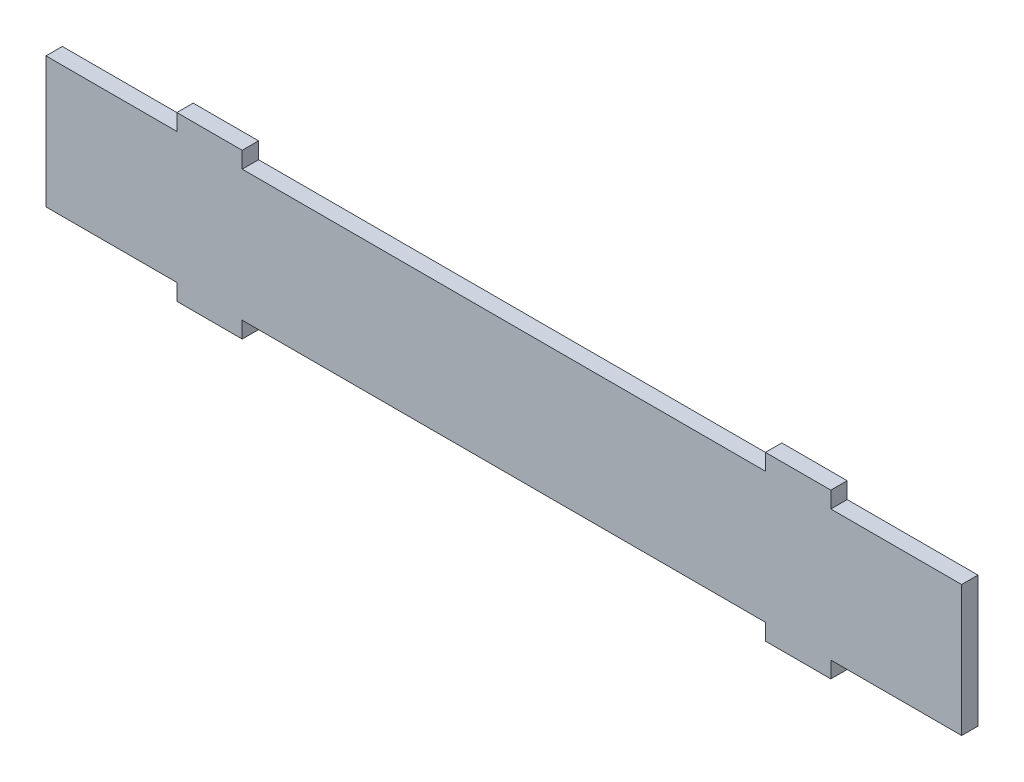
ISO-10303-21;
HEADER;
FILE_DESCRIPTION(('STEP AP214'),'2;1');
FILE_NAME('part.step','',(''),(''),'','','');
FILE_SCHEMA(('AUTOMOTIVE_DESIGN { 1 0 10303 214 1 1 1 1 }'));
ENDSEC;
DATA;
#1=APPLICATION_CONTEXT('core data for automotive mechanical design processes');
#2=APPLICATION_PROTOCOL_DEFINITION('international standard','automotive_design',2000,#1);
#3=PRODUCT_CONTEXT('',#1,'mechanical');
#4=PRODUCT('Part','Part','',(#3));
#5=PRODUCT_RELATED_PRODUCT_CATEGORY('part','',(#4));
#6=PRODUCT_DEFINITION_FORMATION('','',#4);
#7=PRODUCT_DEFINITION_CONTEXT('part definition',#1,'design');
#8=PRODUCT_DEFINITION('design','',#6,#7);
#9=PRODUCT_DEFINITION_SHAPE('','',#8);
#10=(LENGTH_UNIT() NAMED_UNIT(*) SI_UNIT(.MILLI.,.METRE.));
#11=(NAMED_UNIT(*) PLANE_ANGLE_UNIT() SI_UNIT($,.RADIAN.));
#12=(NAMED_UNIT(*) SI_UNIT($,.STERADIAN.) SOLID_ANGLE_UNIT());
#13=UNCERTAINTY_MEASURE_WITH_UNIT(LENGTH_MEASURE(1.E-05),#10,'distance_accuracy_value','');
#14=(GEOMETRIC_REPRESENTATION_CONTEXT(3) GLOBAL_UNCERTAINTY_ASSIGNED_CONTEXT((#13)) GLOBAL_UNIT_ASSIGNED_CONTEXT((#10,
#11,#12)) REPRESENTATION_CONTEXT('',''));
#15=CARTESIAN_POINT('',(0.,0.,0.));
#16=DIRECTION('',(0.,0.,1.));
#17=DIRECTION('',(1.,0.,0.));
#18=AXIS2_PLACEMENT_3D('',#15,#16,#17);
#19=CARTESIAN_POINT('',(0.,0.,3.175));
#20=DIRECTION('',(0.,1.,0.));
#21=DIRECTION('',(0.,0.,1.));
#22=AXIS2_PLACEMENT_3D('',#19,#20,#21);
#23=PLANE('',#22);
#24=DIRECTION('',(0.,0.,-1.));
#25=VECTOR('',#24,1.);
#26=CARTESIAN_POINT('',(139.7,0.,3.175));
#27=LINE('',#26,#25);
#28=CARTESIAN_POINT('',(139.7,0.,3.175));
#29=VERTEX_POINT('',#28);
#30=CARTESIAN_POINT('',(139.7,0.,0.));
#31=VERTEX_POINT('',#30);
#32=EDGE_CURVE('E58',#29,#31,#27,.T.);
#33=ORIENTED_EDGE('',*,*,#32,.F.);
#34=DIRECTION('',(1.,0.,0.));
#35=VECTOR('',#34,1.);
#36=CARTESIAN_POINT('',(0.,0.,3.175));
#37=LINE('',#36,#35);
#38=CARTESIAN_POINT('',(38.1,0.,3.175));
#39=VERTEX_POINT('',#38);
#40=EDGE_CURVE('E341',#39,#29,#37,.T.);
#41=ORIENTED_EDGE('',*,*,#40,.F.);
#42=DIRECTION('',(0.,0.,1.));
#43=VECTOR('',#42,1.);
#44=CARTESIAN_POINT('',(38.1,0.,3.175));
#45=LINE('',#44,#43);
#46=CARTESIAN_POINT('',(38.1,0.,0.));
#47=VERTEX_POINT('',#46);
#48=EDGE_CURVE('E200',#47,#39,#45,.T.);
#49=ORIENTED_EDGE('',*,*,#48,.F.);
#50=DIRECTION('',(1.,0.,0.));
#51=VECTOR('',#50,1.);
#52=CARTESIAN_POINT('',(0.,0.,0.));
#53=LINE('',#52,#51);
#54=EDGE_CURVE('E230',#47,#31,#53,.T.);
#55=ORIENTED_EDGE('',*,*,#54,.T.);
#56=EDGE_LOOP('',(#33,#41,#49,#55));
#57=FACE_BOUND('',#56,.T.);
#58=ADVANCED_FACE('F33',(#57),#23,.F.);
#59=DIRECTION('',(0.,0.,1.));
#60=VECTOR('',#59,1.);
#61=CARTESIAN_POINT('',(152.4,0.,3.175));
#62=LINE('',#61,#60);
#63=CARTESIAN_POINT('',(152.4,0.,0.));
#64=VERTEX_POINT('',#63);
#65=CARTESIAN_POINT('',(152.4,0.,3.175));
#66=VERTEX_POINT('',#65);
#67=EDGE_CURVE('E194',#64,#66,#62,.T.);
#68=ORIENTED_EDGE('',*,*,#67,.F.);
#69=CARTESIAN_POINT('',(177.8,0.,0.));
#70=VERTEX_POINT('',#69);
#71=EDGE_CURVE('E228',#64,#70,#53,.T.);
#72=ORIENTED_EDGE('',*,*,#71,.T.);
#73=DIRECTION('',(0.,0.,-1.));
#74=VECTOR('',#73,1.);
#75=CARTESIAN_POINT('',(177.8,0.,3.175));
#76=LINE('',#75,#74);
#77=CARTESIAN_POINT('',(177.8,0.,3.175));
#78=VERTEX_POINT('',#77);
#79=EDGE_CURVE('E43',#78,#70,#76,.T.);
#80=ORIENTED_EDGE('',*,*,#79,.F.);
#81=EDGE_CURVE('E37',#66,#78,#37,.T.);
#82=ORIENTED_EDGE('',*,*,#81,.F.);
#83=EDGE_LOOP('',(#68,#72,#80,#82));
#84=FACE_BOUND('',#83,.T.);
#85=ADVANCED_FACE('F359',(#84),#23,.F.);
#86=DIRECTION('',(0.,0.,-1.));
#87=VECTOR('',#86,1.);
#88=CARTESIAN_POINT('',(25.4,0.,3.175));
#89=LINE('',#88,#87);
#90=CARTESIAN_POINT('',(25.4,0.,3.175));
#91=VERTEX_POINT('',#90);
#92=CARTESIAN_POINT('',(25.4,0.,0.));
#93=VERTEX_POINT('',#92);
#94=EDGE_CURVE('E197',#91,#93,#89,.T.);
#95=ORIENTED_EDGE('',*,*,#94,.F.);
#96=CARTESIAN_POINT('',(0.,0.,3.175));
#97=VERTEX_POINT('',#96);
#98=EDGE_CURVE('E343',#97,#91,#37,.T.);
#99=ORIENTED_EDGE('',*,*,#98,.F.);
#100=DIRECTION('',(0.,0.,-1.));
#101=VECTOR('',#100,1.);
#102=CARTESIAN_POINT('',(0.,0.,3.175));
#103=LINE('',#102,#101);
#104=CARTESIAN_POINT('',(0.,0.,0.));
#105=VERTEX_POINT('',#104);
#106=EDGE_CURVE('E11',#97,#105,#103,.T.);
#107=ORIENTED_EDGE('',*,*,#106,.T.);
#108=EDGE_CURVE('E243',#105,#93,#53,.T.);
#109=ORIENTED_EDGE('',*,*,#108,.T.);
#110=EDGE_LOOP('',(#95,#99,#107,#109));
#111=FACE_BOUND('',#110,.T.);
#112=ADVANCED_FACE('F361',(#111),#23,.F.);
#113=CARTESIAN_POINT('',(0.,25.4,3.175));
#114=DIRECTION('',(0.,-1.,0.));
#115=DIRECTION('',(0.,0.,-1.));
#116=AXIS2_PLACEMENT_3D('',#113,#114,#115);
#117=PLANE('',#116);
#118=DIRECTION('',(0.,0.,1.));
#119=VECTOR('',#118,1.);
#120=CARTESIAN_POINT('',(139.7,25.4,0.));
#121=LINE('',#120,#119);
#122=CARTESIAN_POINT('',(139.7,25.4,0.));
#123=VERTEX_POINT('',#122);
#124=CARTESIAN_POINT('',(139.7,25.4,3.175));
#125=VERTEX_POINT('',#124);
#126=EDGE_CURVE('E298',#123,#125,#121,.T.);
#127=ORIENTED_EDGE('',*,*,#126,.F.);
#128=DIRECTION('',(-1.,0.,0.));
#129=VECTOR('',#128,1.);
#130=CARTESIAN_POINT('',(0.,25.4,0.));
#131=LINE('',#130,#129);
#132=CARTESIAN_POINT('',(38.1,25.4,0.));
#133=VERTEX_POINT('',#132);
#134=EDGE_CURVE('E249',#123,#133,#131,.T.);
#135=ORIENTED_EDGE('',*,*,#134,.T.);
#136=DIRECTION('',(0.,0.,-1.));
#137=VECTOR('',#136,1.);
#138=CARTESIAN_POINT('',(38.1,25.4,0.));
#139=LINE('',#138,#137);
#140=CARTESIAN_POINT('',(38.1,25.4,3.175));
#141=VERTEX_POINT('',#140);
#142=EDGE_CURVE('E295',#141,#133,#139,.T.);
#143=ORIENTED_EDGE('',*,*,#142,.F.);
#144=DIRECTION('',(-1.,0.,0.));
#145=VECTOR('',#144,1.);
#146=CARTESIAN_POINT('',(0.,25.4,3.175));
#147=LINE('',#146,#145);
#148=EDGE_CURVE('E245',#125,#141,#147,.T.);
#149=ORIENTED_EDGE('',*,*,#148,.F.);
#150=EDGE_LOOP('',(#127,#135,#143,#149));
#151=FACE_BOUND('',#150,.T.);
#152=ADVANCED_FACE('F294',(#151),#117,.F.);
#153=DIRECTION('',(0.,0.,-1.));
#154=VECTOR('',#153,1.);
#155=CARTESIAN_POINT('',(152.4,25.4,0.));
#156=LINE('',#155,#154);
#157=CARTESIAN_POINT('',(152.4,25.4,3.175));
#158=VERTEX_POINT('',#157);
#159=CARTESIAN_POINT('',(152.4,25.4,0.));
#160=VERTEX_POINT('',#159);
#161=EDGE_CURVE('E577',#158,#160,#156,.T.);
#162=ORIENTED_EDGE('',*,*,#161,.F.);
#163=CARTESIAN_POINT('',(177.8,25.4,3.175));
#164=VERTEX_POINT('',#163);
#165=EDGE_CURVE('E247',#164,#158,#147,.T.);
#166=ORIENTED_EDGE('',*,*,#165,.F.);
#167=DIRECTION('',(0.,0.,-1.));
#168=VECTOR('',#167,1.);
#169=CARTESIAN_POINT('',(177.8,25.4,3.175));
#170=LINE('',#169,#168);
#171=CARTESIAN_POINT('',(177.8,25.4,0.));
#172=VERTEX_POINT('',#171);
#173=EDGE_CURVE('E271',#164,#172,#170,.T.);
#174=ORIENTED_EDGE('',*,*,#173,.T.);
#175=EDGE_CURVE('E264',#172,#160,#131,.T.);
#176=ORIENTED_EDGE('',*,*,#175,.T.);
#177=EDGE_LOOP('',(#162,#166,#174,#176));
#178=FACE_BOUND('',#177,.T.);
#179=ADVANCED_FACE('F373',(#178),#117,.F.);
#180=DIRECTION('',(0.,0.,1.));
#181=VECTOR('',#180,1.);
#182=CARTESIAN_POINT('',(25.4,25.4,0.));
#183=LINE('',#182,#181);
#184=CARTESIAN_POINT('',(25.4,25.4,0.));
#185=VERTEX_POINT('',#184);
#186=CARTESIAN_POINT('',(25.4,25.4,3.175));
#187=VERTEX_POINT('',#186);
#188=EDGE_CURVE('E311',#185,#187,#183,.T.);
#189=ORIENTED_EDGE('',*,*,#188,.F.);
#190=CARTESIAN_POINT('',(0.,25.4,0.));
#191=VERTEX_POINT('',#190);
#192=EDGE_CURVE('E262',#185,#191,#131,.T.);
#193=ORIENTED_EDGE('',*,*,#192,.T.);
#194=DIRECTION('',(0.,0.,-1.));
#195=VECTOR('',#194,1.);
#196=CARTESIAN_POINT('',(0.,25.4,3.175));
#197=LINE('',#196,#195);
#198=CARTESIAN_POINT('',(0.,25.4,3.175));
#199=VERTEX_POINT('',#198);
#200=EDGE_CURVE('E261',#199,#191,#197,.T.);
#201=ORIENTED_EDGE('',*,*,#200,.F.);
#202=EDGE_CURVE('E248',#187,#199,#147,.T.);
#203=ORIENTED_EDGE('',*,*,#202,.F.);
#204=EDGE_LOOP('',(#189,#193,#201,#203));
#205=FACE_BOUND('',#204,.T.);
#206=ADVANCED_FACE('F370',(#205),#117,.F.);
#207=CARTESIAN_POINT('',(0.,0.,3.175));
#208=DIRECTION('',(1.,0.,0.));
#209=DIRECTION('',(0.,0.,-1.));
#210=AXIS2_PLACEMENT_3D('',#207,#208,#209);
#211=PLANE('',#210);
#212=DIRECTION('',(0.,-1.,0.));
#213=VECTOR('',#212,1.);
#214=CARTESIAN_POINT('',(0.,0.,0.));
#215=LINE('',#214,#213);
#216=EDGE_CURVE('E231',#191,#105,#215,.T.);
#217=ORIENTED_EDGE('',*,*,#216,.T.);
#218=ORIENTED_EDGE('',*,*,#106,.F.);
#219=DIRECTION('',(0.,-1.,0.));
#220=VECTOR('',#219,1.);
#221=CARTESIAN_POINT('',(0.,0.,3.175));
#222=LINE('',#221,#220);
#223=EDGE_CURVE('E287',#199,#97,#222,.T.);
#224=ORIENTED_EDGE('',*,*,#223,.F.);
#225=ORIENTED_EDGE('',*,*,#200,.T.);
#226=EDGE_LOOP('',(#217,#218,#224,#225));
#227=FACE_BOUND('',#226,.T.);
#228=ADVANCED_FACE('F35',(#227),#211,.F.);
#229=CARTESIAN_POINT('',(177.8,0.,3.175));
#230=DIRECTION('',(-1.,0.,0.));
#231=DIRECTION('',(0.,0.,1.));
#232=AXIS2_PLACEMENT_3D('',#229,#230,#231);
#233=PLANE('',#232);
#234=DIRECTION('',(0.,1.,0.));
#235=VECTOR('',#234,1.);
#236=CARTESIAN_POINT('',(177.8,0.,0.));
#237=LINE('',#236,#235);
#238=EDGE_CURVE('E236',#70,#172,#237,.T.);
#239=ORIENTED_EDGE('',*,*,#238,.T.);
#240=ORIENTED_EDGE('',*,*,#173,.F.);
#241=DIRECTION('',(0.,1.,0.));
#242=VECTOR('',#241,1.);
#243=CARTESIAN_POINT('',(177.8,0.,3.175));
#244=LINE('',#243,#242);
#245=EDGE_CURVE('E253',#78,#164,#244,.T.);
#246=ORIENTED_EDGE('',*,*,#245,.F.);
#247=ORIENTED_EDGE('',*,*,#79,.T.);
#248=EDGE_LOOP('',(#239,#240,#246,#247));
#249=FACE_BOUND('',#248,.T.);
#250=ADVANCED_FACE('F278',(#249),#233,.F.);
#251=CARTESIAN_POINT('',(0.,0.,3.175));
#252=DIRECTION('',(0.,0.,-1.));
#253=DIRECTION('',(-1.,0.,0.));
#254=AXIS2_PLACEMENT_3D('',#251,#252,#253);
#255=PLANE('',#254);
#256=ORIENTED_EDGE('',*,*,#223,.T.);
#257=ORIENTED_EDGE('',*,*,#98,.T.);
#258=DIRECTION('',(0.,1.,0.));
#259=VECTOR('',#258,1.);
#260=CARTESIAN_POINT('',(25.4,-3.175,3.175));
#261=LINE('',#260,#259);
#262=CARTESIAN_POINT('',(25.4,-3.175,3.175));
#263=VERTEX_POINT('',#262);
#264=EDGE_CURVE('E215',#263,#91,#261,.T.);
#265=ORIENTED_EDGE('',*,*,#264,.F.);
#266=DIRECTION('',(-1.,0.,0.));
#267=VECTOR('',#266,1.);
#268=CARTESIAN_POINT('',(25.4,-3.175,3.175));
#269=LINE('',#268,#267);
#270=CARTESIAN_POINT('',(38.1,-3.175,3.175));
#271=VERTEX_POINT('',#270);
#272=EDGE_CURVE('E213',#271,#263,#269,.T.);
#273=ORIENTED_EDGE('',*,*,#272,.F.);
#274=DIRECTION('',(0.,1.,0.));
#275=VECTOR('',#274,1.);
#276=CARTESIAN_POINT('',(38.1,-3.175,3.175));
#277=LINE('',#276,#275);
#278=EDGE_CURVE('E226',#271,#39,#277,.T.);
#279=ORIENTED_EDGE('',*,*,#278,.T.);
#280=ORIENTED_EDGE('',*,*,#40,.T.);
#281=DIRECTION('',(0.,1.,0.));
#282=VECTOR('',#281,1.);
#283=CARTESIAN_POINT('',(139.7,-3.175,3.175));
#284=LINE('',#283,#282);
#285=CARTESIAN_POINT('',(139.7,-3.175,3.175));
#286=VERTEX_POINT('',#285);
#287=EDGE_CURVE('E352',#286,#29,#284,.T.);
#288=ORIENTED_EDGE('',*,*,#287,.F.);
#289=DIRECTION('',(-1.,0.,0.));
#290=VECTOR('',#289,1.);
#291=CARTESIAN_POINT('',(139.7,-3.175,3.175));
#292=LINE('',#291,#290);
#293=CARTESIAN_POINT('',(152.4,-3.175,3.175));
#294=VERTEX_POINT('',#293);
#295=EDGE_CURVE('E190',#294,#286,#292,.T.);
#296=ORIENTED_EDGE('',*,*,#295,.F.);
#297=DIRECTION('',(0.,1.,0.));
#298=VECTOR('',#297,1.);
#299=CARTESIAN_POINT('',(152.4,-3.175,3.175));
#300=LINE('',#299,#298);
#301=EDGE_CURVE('E202',#294,#66,#300,.T.);
#302=ORIENTED_EDGE('',*,*,#301,.T.);
#303=ORIENTED_EDGE('',*,*,#81,.T.);
#304=ORIENTED_EDGE('',*,*,#245,.T.);
#305=ORIENTED_EDGE('',*,*,#165,.T.);
#306=DIRECTION('',(0.,-1.,0.));
#307=VECTOR('',#306,1.);
#308=CARTESIAN_POINT('',(152.4,28.575,3.175));
#309=LINE('',#308,#307);
#310=CARTESIAN_POINT('',(152.4,28.575,3.175));
#311=VERTEX_POINT('',#310);
#312=EDGE_CURVE('E582',#311,#158,#309,.T.);
#313=ORIENTED_EDGE('',*,*,#312,.F.);
#314=DIRECTION('',(1.,0.,0.));
#315=VECTOR('',#314,1.);
#316=CARTESIAN_POINT('',(139.7,28.575,3.175));
#317=LINE('',#316,#315);
#318=CARTESIAN_POINT('',(139.7,28.575,3.175));
#319=VERTEX_POINT('',#318);
#320=EDGE_CURVE('E601',#319,#311,#317,.T.);
#321=ORIENTED_EDGE('',*,*,#320,.F.);
#322=DIRECTION('',(0.,-1.,0.));
#323=VECTOR('',#322,1.);
#324=CARTESIAN_POINT('',(139.7,28.575,3.175));
#325=LINE('',#324,#323);
#326=EDGE_CURVE('E332',#319,#125,#325,.T.);
#327=ORIENTED_EDGE('',*,*,#326,.T.);
#328=ORIENTED_EDGE('',*,*,#148,.T.);
#329=DIRECTION('',(0.,-1.,0.));
#330=VECTOR('',#329,1.);
#331=CARTESIAN_POINT('',(38.1,28.575,3.175));
#332=LINE('',#331,#330);
#333=CARTESIAN_POINT('',(38.1,28.575,3.175));
#334=VERTEX_POINT('',#333);
#335=EDGE_CURVE('E309',#334,#141,#332,.T.);
#336=ORIENTED_EDGE('',*,*,#335,.F.);
#337=DIRECTION('',(1.,0.,0.));
#338=VECTOR('',#337,1.);
#339=CARTESIAN_POINT('',(25.4,28.575,3.175));
#340=LINE('',#339,#338);
#341=CARTESIAN_POINT('',(25.4,28.575,3.175));
#342=VERTEX_POINT('',#341);
#343=EDGE_CURVE('E594',#342,#334,#340,.T.);
#344=ORIENTED_EDGE('',*,*,#343,.F.);
#345=DIRECTION('',(0.,-1.,0.));
#346=VECTOR('',#345,1.);
#347=CARTESIAN_POINT('',(25.4,28.575,3.175));
#348=LINE('',#347,#346);
#349=EDGE_CURVE('E316',#342,#187,#348,.T.);
#350=ORIENTED_EDGE('',*,*,#349,.T.);
#351=ORIENTED_EDGE('',*,*,#202,.T.);
#352=EDGE_LOOP('',(#256,#257,#265,#273,#279,#280,#288,#296,#302,#303,#304,#305,#313,#321,#327,
#328,#336,#344,#350,#351));
#353=FACE_BOUND('',#352,.T.);
#354=ADVANCED_FACE('F349',(#353),#255,.F.);
#355=CARTESIAN_POINT('',(0.,0.,0.));
#356=DIRECTION('',(0.,0.,-1.));
#357=DIRECTION('',(-1.,0.,0.));
#358=AXIS2_PLACEMENT_3D('',#355,#356,#357);
#359=PLANE('',#358);
#360=ORIENTED_EDGE('',*,*,#216,.F.);
#361=ORIENTED_EDGE('',*,*,#192,.F.);
#362=DIRECTION('',(0.,-1.,0.));
#363=VECTOR('',#362,1.);
#364=CARTESIAN_POINT('',(25.4,28.575,0.));
#365=LINE('',#364,#363);
#366=CARTESIAN_POINT('',(25.4,28.575,0.));
#367=VERTEX_POINT('',#366);
#368=EDGE_CURVE('E314',#367,#185,#365,.T.);
#369=ORIENTED_EDGE('',*,*,#368,.F.);
#370=DIRECTION('',(-1.,0.,0.));
#371=VECTOR('',#370,1.);
#372=CARTESIAN_POINT('',(25.4,28.575,0.));
#373=LINE('',#372,#371);
#374=CARTESIAN_POINT('',(38.1,28.575,0.));
#375=VERTEX_POINT('',#374);
#376=EDGE_CURVE('E313',#375,#367,#373,.T.);
#377=ORIENTED_EDGE('',*,*,#376,.F.);
#378=DIRECTION('',(0.,-1.,0.));
#379=VECTOR('',#378,1.);
#380=CARTESIAN_POINT('',(38.1,28.575,0.));
#381=LINE('',#380,#379);
#382=EDGE_CURVE('E306',#375,#133,#381,.T.);
#383=ORIENTED_EDGE('',*,*,#382,.T.);
#384=ORIENTED_EDGE('',*,*,#134,.F.);
#385=DIRECTION('',(0.,-1.,0.));
#386=VECTOR('',#385,1.);
#387=CARTESIAN_POINT('',(139.7,28.575,0.));
#388=LINE('',#387,#386);
#389=CARTESIAN_POINT('',(139.7,28.575,0.));
#390=VERTEX_POINT('',#389);
#391=EDGE_CURVE('E588',#390,#123,#388,.T.);
#392=ORIENTED_EDGE('',*,*,#391,.F.);
#393=DIRECTION('',(-1.,0.,0.));
#394=VECTOR('',#393,1.);
#395=CARTESIAN_POINT('',(139.7,28.575,0.));
#396=LINE('',#395,#394);
#397=CARTESIAN_POINT('',(152.4,28.575,0.));
#398=VERTEX_POINT('',#397);
#399=EDGE_CURVE('E609',#398,#390,#396,.T.);
#400=ORIENTED_EDGE('',*,*,#399,.F.);
#401=DIRECTION('',(0.,-1.,0.));
#402=VECTOR('',#401,1.);
#403=CARTESIAN_POINT('',(152.4,28.575,0.));
#404=LINE('',#403,#402);
#405=EDGE_CURVE('E284',#398,#160,#404,.T.);
#406=ORIENTED_EDGE('',*,*,#405,.T.);
#407=ORIENTED_EDGE('',*,*,#175,.F.);
#408=ORIENTED_EDGE('',*,*,#238,.F.);
#409=ORIENTED_EDGE('',*,*,#71,.F.);
#410=DIRECTION('',(0.,1.,0.));
#411=VECTOR('',#410,1.);
#412=CARTESIAN_POINT('',(152.4,-3.175,0.));
#413=LINE('',#412,#411);
#414=CARTESIAN_POINT('',(152.4,-3.175,0.));
#415=VERTEX_POINT('',#414);
#416=EDGE_CURVE('E181',#415,#64,#413,.T.);
#417=ORIENTED_EDGE('',*,*,#416,.F.);
#418=DIRECTION('',(1.,0.,0.));
#419=VECTOR('',#418,1.);
#420=CARTESIAN_POINT('',(139.7,-3.175,0.));
#421=LINE('',#420,#419);
#422=CARTESIAN_POINT('',(139.7,-3.175,0.));
#423=VERTEX_POINT('',#422);
#424=EDGE_CURVE('E173',#423,#415,#421,.T.);
#425=ORIENTED_EDGE('',*,*,#424,.F.);
#426=DIRECTION('',(0.,1.,0.));
#427=VECTOR('',#426,1.);
#428=CARTESIAN_POINT('',(139.7,-3.175,0.));
#429=LINE('',#428,#427);
#430=EDGE_CURVE('E179',#423,#31,#429,.T.);
#431=ORIENTED_EDGE('',*,*,#430,.T.);
#432=ORIENTED_EDGE('',*,*,#54,.F.);
#433=DIRECTION('',(0.,1.,0.));
#434=VECTOR('',#433,1.);
#435=CARTESIAN_POINT('',(38.1,-3.175,0.));
#436=LINE('',#435,#434);
#437=CARTESIAN_POINT('',(38.1,-3.175,0.));
#438=VERTEX_POINT('',#437);
#439=EDGE_CURVE('E607',#438,#47,#436,.T.);
#440=ORIENTED_EDGE('',*,*,#439,.F.);
#441=DIRECTION('',(1.,0.,0.));
#442=VECTOR('',#441,1.);
#443=CARTESIAN_POINT('',(25.4,-3.175,0.));
#444=LINE('',#443,#442);
#445=CARTESIAN_POINT('',(25.4,-3.175,0.));
#446=VERTEX_POINT('',#445);
#447=EDGE_CURVE('E209',#446,#438,#444,.T.);
#448=ORIENTED_EDGE('',*,*,#447,.F.);
#449=DIRECTION('',(0.,1.,0.));
#450=VECTOR('',#449,1.);
#451=CARTESIAN_POINT('',(25.4,-3.175,0.));
#452=LINE('',#451,#450);
#453=EDGE_CURVE('E604',#446,#93,#452,.T.);
#454=ORIENTED_EDGE('',*,*,#453,.T.);
#455=ORIENTED_EDGE('',*,*,#108,.F.);
#456=EDGE_LOOP('',(#360,#361,#369,#377,#383,#384,#392,#400,#406,#407,#408,#409,#417,#425,#431,
#432,#440,#448,#454,#455));
#457=FACE_BOUND('',#456,.T.);
#458=ADVANCED_FACE('F176',(#457),#359,.T.);
#459=CARTESIAN_POINT('',(25.4,28.575,0.));
#460=DIRECTION('',(1.,0.,0.));
#461=DIRECTION('',(0.,0.,-1.));
#462=AXIS2_PLACEMENT_3D('',#459,#460,#461);
#463=PLANE('',#462);
#464=ORIENTED_EDGE('',*,*,#188,.T.);
#465=ORIENTED_EDGE('',*,*,#349,.F.);
#466=DIRECTION('',(0.,0.,1.));
#467=VECTOR('',#466,1.);
#468=CARTESIAN_POINT('',(25.4,28.575,0.));
#469=LINE('',#468,#467);
#470=EDGE_CURVE('E310',#367,#342,#469,.T.);
#471=ORIENTED_EDGE('',*,*,#470,.F.);
#472=ORIENTED_EDGE('',*,*,#368,.T.);
#473=EDGE_LOOP('',(#464,#465,#471,#472));
#474=FACE_BOUND('',#473,.T.);
#475=ADVANCED_FACE('F377',(#474),#463,.F.);
#476=CARTESIAN_POINT('',(38.1,28.575,0.));
#477=DIRECTION('',(-1.,0.,0.));
#478=DIRECTION('',(0.,0.,1.));
#479=AXIS2_PLACEMENT_3D('',#476,#477,#478);
#480=PLANE('',#479);
#481=ORIENTED_EDGE('',*,*,#142,.T.);
#482=ORIENTED_EDGE('',*,*,#382,.F.);
#483=DIRECTION('',(0.,0.,-1.));
#484=VECTOR('',#483,1.);
#485=CARTESIAN_POINT('',(38.1,28.575,0.));
#486=LINE('',#485,#484);
#487=EDGE_CURVE('E595',#334,#375,#486,.T.);
#488=ORIENTED_EDGE('',*,*,#487,.F.);
#489=ORIENTED_EDGE('',*,*,#335,.T.);
#490=EDGE_LOOP('',(#481,#482,#488,#489));
#491=FACE_BOUND('',#490,.T.);
#492=ADVANCED_FACE('F304',(#491),#480,.F.);
#493=CARTESIAN_POINT('',(0.,28.575,0.));
#494=DIRECTION('',(0.,1.,0.));
#495=DIRECTION('',(0.,0.,1.));
#496=AXIS2_PLACEMENT_3D('',#493,#494,#495);
#497=PLANE('',#496);
#498=ORIENTED_EDGE('',*,*,#470,.T.);
#499=ORIENTED_EDGE('',*,*,#343,.T.);
#500=ORIENTED_EDGE('',*,*,#487,.T.);
#501=ORIENTED_EDGE('',*,*,#376,.T.);
#502=EDGE_LOOP('',(#498,#499,#500,#501));
#503=FACE_BOUND('',#502,.T.);
#504=ADVANCED_FACE('F385',(#503),#497,.T.);
#505=CARTESIAN_POINT('',(139.7,28.575,0.));
#506=DIRECTION('',(1.,0.,0.));
#507=DIRECTION('',(0.,0.,-1.));
#508=AXIS2_PLACEMENT_3D('',#505,#506,#507);
#509=PLANE('',#508);
#510=ORIENTED_EDGE('',*,*,#126,.T.);
#511=ORIENTED_EDGE('',*,*,#326,.F.);
#512=DIRECTION('',(0.,0.,1.));
#513=VECTOR('',#512,1.);
#514=CARTESIAN_POINT('',(139.7,28.575,0.));
#515=LINE('',#514,#513);
#516=EDGE_CURVE('E579',#390,#319,#515,.T.);
#517=ORIENTED_EDGE('',*,*,#516,.F.);
#518=ORIENTED_EDGE('',*,*,#391,.T.);
#519=EDGE_LOOP('',(#510,#511,#517,#518));
#520=FACE_BOUND('',#519,.T.);
#521=ADVANCED_FACE('F388',(#520),#509,.F.);
#522=CARTESIAN_POINT('',(152.4,28.575,0.));
#523=DIRECTION('',(-1.,0.,0.));
#524=DIRECTION('',(0.,0.,1.));
#525=AXIS2_PLACEMENT_3D('',#522,#523,#524);
#526=PLANE('',#525);
#527=ORIENTED_EDGE('',*,*,#161,.T.);
#528=ORIENTED_EDGE('',*,*,#405,.F.);
#529=DIRECTION('',(0.,0.,-1.));
#530=VECTOR('',#529,1.);
#531=CARTESIAN_POINT('',(152.4,28.575,0.));
#532=LINE('',#531,#530);
#533=EDGE_CURVE('E584',#311,#398,#532,.T.);
#534=ORIENTED_EDGE('',*,*,#533,.F.);
#535=ORIENTED_EDGE('',*,*,#312,.T.);
#536=EDGE_LOOP('',(#527,#528,#534,#535));
#537=FACE_BOUND('',#536,.T.);
#538=ADVANCED_FACE('F392',(#537),#526,.F.);
#539=CARTESIAN_POINT('',(0.,28.575,0.));
#540=DIRECTION('',(0.,1.,0.));
#541=DIRECTION('',(0.,0.,1.));
#542=AXIS2_PLACEMENT_3D('',#539,#540,#541);
#543=PLANE('',#542);
#544=ORIENTED_EDGE('',*,*,#516,.T.);
#545=ORIENTED_EDGE('',*,*,#320,.T.);
#546=ORIENTED_EDGE('',*,*,#533,.T.);
#547=ORIENTED_EDGE('',*,*,#399,.T.);
#548=EDGE_LOOP('',(#544,#545,#546,#547));
#549=FACE_BOUND('',#548,.T.);
#550=ADVANCED_FACE('F396',(#549),#543,.T.);
#551=CARTESIAN_POINT('',(25.4,-3.175,3.175));
#552=DIRECTION('',(1.,0.,0.));
#553=DIRECTION('',(0.,0.,-1.));
#554=AXIS2_PLACEMENT_3D('',#551,#552,#553);
#555=PLANE('',#554);
#556=ORIENTED_EDGE('',*,*,#94,.T.);
#557=ORIENTED_EDGE('',*,*,#453,.F.);
#558=DIRECTION('',(0.,0.,-1.));
#559=VECTOR('',#558,1.);
#560=CARTESIAN_POINT('',(25.4,-3.175,3.175));
#561=LINE('',#560,#559);
#562=EDGE_CURVE('E206',#263,#446,#561,.T.);
#563=ORIENTED_EDGE('',*,*,#562,.F.);
#564=ORIENTED_EDGE('',*,*,#264,.T.);
#565=EDGE_LOOP('',(#556,#557,#563,#564));
#566=FACE_BOUND('',#565,.T.);
#567=ADVANCED_FACE('F400',(#566),#555,.F.);
#568=CARTESIAN_POINT('',(38.1,-3.175,3.175));
#569=DIRECTION('',(-1.,0.,0.));
#570=DIRECTION('',(0.,0.,1.));
#571=AXIS2_PLACEMENT_3D('',#568,#569,#570);
#572=PLANE('',#571);
#573=ORIENTED_EDGE('',*,*,#48,.T.);
#574=ORIENTED_EDGE('',*,*,#278,.F.);
#575=DIRECTION('',(0.,0.,1.));
#576=VECTOR('',#575,1.);
#577=CARTESIAN_POINT('',(38.1,-3.175,3.175));
#578=LINE('',#577,#576);
#579=EDGE_CURVE('E211',#438,#271,#578,.T.);
#580=ORIENTED_EDGE('',*,*,#579,.F.);
#581=ORIENTED_EDGE('',*,*,#439,.T.);
#582=EDGE_LOOP('',(#573,#574,#580,#581));
#583=FACE_BOUND('',#582,.T.);
#584=ADVANCED_FACE('F404',(#583),#572,.F.);
#585=CARTESIAN_POINT('',(0.,-3.175,0.));
#586=DIRECTION('',(0.,-1.,0.));
#587=DIRECTION('',(0.,0.,-1.));
#588=AXIS2_PLACEMENT_3D('',#585,#586,#587);
#589=PLANE('',#588);
#590=ORIENTED_EDGE('',*,*,#562,.T.);
#591=ORIENTED_EDGE('',*,*,#447,.T.);
#592=ORIENTED_EDGE('',*,*,#579,.T.);
#593=ORIENTED_EDGE('',*,*,#272,.T.);
#594=EDGE_LOOP('',(#590,#591,#592,#593));
#595=FACE_BOUND('',#594,.T.);
#596=ADVANCED_FACE('F408',(#595),#589,.T.);
#597=CARTESIAN_POINT('',(139.7,-3.175,3.175));
#598=DIRECTION('',(1.,0.,0.));
#599=DIRECTION('',(0.,0.,-1.));
#600=AXIS2_PLACEMENT_3D('',#597,#598,#599);
#601=PLANE('',#600);
#602=ORIENTED_EDGE('',*,*,#32,.T.);
#603=ORIENTED_EDGE('',*,*,#430,.F.);
#604=DIRECTION('',(0.,0.,-1.));
#605=VECTOR('',#604,1.);
#606=CARTESIAN_POINT('',(139.7,-3.175,3.175));
#607=LINE('',#606,#605);
#608=EDGE_CURVE('E185',#286,#423,#607,.T.);
#609=ORIENTED_EDGE('',*,*,#608,.F.);
#610=ORIENTED_EDGE('',*,*,#287,.T.);
#611=EDGE_LOOP('',(#602,#603,#609,#610));
#612=FACE_BOUND('',#611,.T.);
#613=ADVANCED_FACE('F196',(#612),#601,.F.);
#614=CARTESIAN_POINT('',(152.4,-3.175,3.175));
#615=DIRECTION('',(-1.,0.,0.));
#616=DIRECTION('',(0.,0.,1.));
#617=AXIS2_PLACEMENT_3D('',#614,#615,#616);
#618=PLANE('',#617);
#619=ORIENTED_EDGE('',*,*,#67,.T.);
#620=ORIENTED_EDGE('',*,*,#301,.F.);
#621=DIRECTION('',(0.,0.,1.));
#622=VECTOR('',#621,1.);
#623=CARTESIAN_POINT('',(152.4,-3.175,3.175));
#624=LINE('',#623,#622);
#625=EDGE_CURVE('E184',#415,#294,#624,.T.);
#626=ORIENTED_EDGE('',*,*,#625,.F.);
#627=ORIENTED_EDGE('',*,*,#416,.T.);
#628=EDGE_LOOP('',(#619,#620,#626,#627));
#629=FACE_BOUND('',#628,.T.);
#630=ADVANCED_FACE('F358',(#629),#618,.F.);
#631=CARTESIAN_POINT('',(0.,-3.175,0.));
#632=DIRECTION('',(0.,-1.,0.));
#633=DIRECTION('',(0.,0.,-1.));
#634=AXIS2_PLACEMENT_3D('',#631,#632,#633);
#635=PLANE('',#634);
#636=ORIENTED_EDGE('',*,*,#608,.T.);
#637=ORIENTED_EDGE('',*,*,#424,.T.);
#638=ORIENTED_EDGE('',*,*,#625,.T.);
#639=ORIENTED_EDGE('',*,*,#295,.T.);
#640=EDGE_LOOP('',(#636,#637,#638,#639));
#641=FACE_BOUND('',#640,.T.);
#642=ADVANCED_FACE('F188',(#641),#635,.T.);
#643=CLOSED_SHELL('',(#58,#85,#112,#152,#179,#206,#228,#250,#354,#458,#475,#492,#504,#521,#538,
#550,#567,#584,#596,#613,#630,#642));
#644=MANIFOLD_SOLID_BREP('B2',#643);
#645=ADVANCED_BREP_SHAPE_REPRESENTATION('',(#18,#644),#14);
#646=SHAPE_DEFINITION_REPRESENTATION(#9,#645);
ENDSEC;
END-ISO-10303-21;
